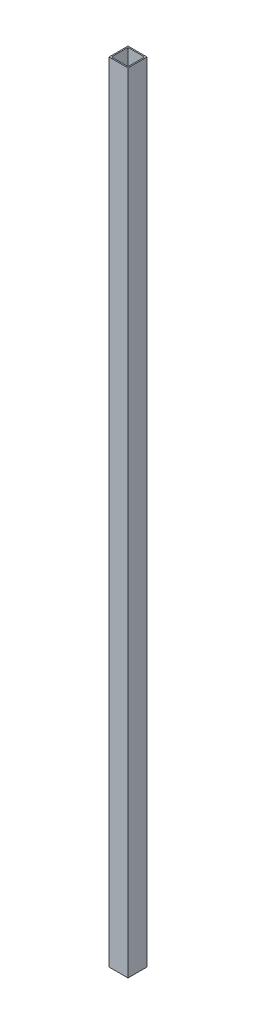
ISO-10303-21;
HEADER;
FILE_DESCRIPTION(('STEP AP214'),'2;1');
FILE_NAME('part.step','',(''),(''),'','','');
FILE_SCHEMA(('AUTOMOTIVE_DESIGN { 1 0 10303 214 1 1 1 1 }'));
ENDSEC;
DATA;
#1=APPLICATION_CONTEXT('core data for automotive mechanical design processes');
#2=APPLICATION_PROTOCOL_DEFINITION('international standard','automotive_design',2000,#1);
#3=PRODUCT_CONTEXT('',#1,'mechanical');
#4=PRODUCT('Part','Part','',(#3));
#5=PRODUCT_RELATED_PRODUCT_CATEGORY('part','',(#4));
#6=PRODUCT_DEFINITION_FORMATION('','',#4);
#7=PRODUCT_DEFINITION_CONTEXT('part definition',#1,'design');
#8=PRODUCT_DEFINITION('design','',#6,#7);
#9=PRODUCT_DEFINITION_SHAPE('','',#8);
#10=(LENGTH_UNIT() NAMED_UNIT(*) SI_UNIT(.MILLI.,.METRE.));
#11=(NAMED_UNIT(*) PLANE_ANGLE_UNIT() SI_UNIT($,.RADIAN.));
#12=(NAMED_UNIT(*) SI_UNIT($,.STERADIAN.) SOLID_ANGLE_UNIT());
#13=UNCERTAINTY_MEASURE_WITH_UNIT(LENGTH_MEASURE(1.E-05),#10,'distance_accuracy_value','');
#14=(GEOMETRIC_REPRESENTATION_CONTEXT(3) GLOBAL_UNCERTAINTY_ASSIGNED_CONTEXT((#13)) GLOBAL_UNIT_ASSIGNED_CONTEXT((#10,
#11,#12)) REPRESENTATION_CONTEXT('',''));
#15=CARTESIAN_POINT('',(0.,0.,0.));
#16=DIRECTION('',(0.,0.,1.));
#17=DIRECTION('',(1.,0.,0.));
#18=AXIS2_PLACEMENT_3D('',#15,#16,#17);
#19=CARTESIAN_POINT('',(0.,1054.1,0.));
#20=DIRECTION('',(0.,-1.,0.));
#21=DIRECTION('',(0.,0.,-1.));
#22=AXIS2_PLACEMENT_3D('',#19,#20,#21);
#23=PLANE('',#22);
#24=DIRECTION('',(0.,0.,-1.));
#25=VECTOR('',#24,1.);
#26=CARTESIAN_POINT('',(12.7,1054.1,12.7));
#27=LINE('',#26,#25);
#28=CARTESIAN_POINT('',(12.7,1054.1,12.7));
#29=VERTEX_POINT('',#28);
#30=CARTESIAN_POINT('',(12.7,1054.1,-12.7));
#31=VERTEX_POINT('',#30);
#32=EDGE_CURVE('E136',#29,#31,#27,.T.);
#33=ORIENTED_EDGE('',*,*,#32,.T.);
#34=DIRECTION('',(-1.,0.,0.));
#35=VECTOR('',#34,1.);
#36=CARTESIAN_POINT('',(-12.7,1054.1,-12.7));
#37=LINE('',#36,#35);
#38=CARTESIAN_POINT('',(-12.7,1054.1,-12.7));
#39=VERTEX_POINT('',#38);
#40=EDGE_CURVE('E139',#31,#39,#37,.T.);
#41=ORIENTED_EDGE('',*,*,#40,.T.);
#42=DIRECTION('',(0.,0.,1.));
#43=VECTOR('',#42,1.);
#44=CARTESIAN_POINT('',(-12.7,1054.1,12.7));
#45=LINE('',#44,#43);
#46=CARTESIAN_POINT('',(-12.7,1054.1,12.7));
#47=VERTEX_POINT('',#46);
#48=EDGE_CURVE('E142',#39,#47,#45,.T.);
#49=ORIENTED_EDGE('',*,*,#48,.T.);
#50=DIRECTION('',(1.,0.,0.));
#51=VECTOR('',#50,1.);
#52=CARTESIAN_POINT('',(-12.7,1054.1,12.7));
#53=LINE('',#52,#51);
#54=EDGE_CURVE('E144',#47,#29,#53,.T.);
#55=ORIENTED_EDGE('',*,*,#54,.T.);
#56=EDGE_LOOP('',(#33,#41,#49,#55));
#57=FACE_BOUND('',#56,.T.);
#58=DIRECTION('',(0.,0.,-1.));
#59=VECTOR('',#58,1.);
#60=CARTESIAN_POINT('',(11.1125,1054.1,11.1125));
#61=LINE('',#60,#59);
#62=CARTESIAN_POINT('',(11.1125,1054.1,11.1125));
#63=VERTEX_POINT('',#62);
#64=CARTESIAN_POINT('',(11.1125,1054.1,-11.1125));
#65=VERTEX_POINT('',#64);
#66=EDGE_CURVE('E100',#63,#65,#61,.T.);
#67=ORIENTED_EDGE('',*,*,#66,.F.);
#68=DIRECTION('',(1.,0.,0.));
#69=VECTOR('',#68,1.);
#70=CARTESIAN_POINT('',(-11.1125,1054.1,11.1125));
#71=LINE('',#70,#69);
#72=CARTESIAN_POINT('',(-11.1125,1054.1,11.1125));
#73=VERTEX_POINT('',#72);
#74=EDGE_CURVE('E122',#73,#63,#71,.T.);
#75=ORIENTED_EDGE('',*,*,#74,.F.);
#76=DIRECTION('',(0.,0.,1.));
#77=VECTOR('',#76,1.);
#78=CARTESIAN_POINT('',(-11.1125,1054.1,11.1125));
#79=LINE('',#78,#77);
#80=CARTESIAN_POINT('',(-11.1125,1054.1,-11.1125));
#81=VERTEX_POINT('',#80);
#82=EDGE_CURVE('E120',#81,#73,#79,.T.);
#83=ORIENTED_EDGE('',*,*,#82,.F.);
#84=DIRECTION('',(-1.,0.,0.));
#85=VECTOR('',#84,1.);
#86=CARTESIAN_POINT('',(-11.1125,1054.1,-11.1125));
#87=LINE('',#86,#85);
#88=EDGE_CURVE('E108',#65,#81,#87,.T.);
#89=ORIENTED_EDGE('',*,*,#88,.F.);
#90=EDGE_LOOP('',(#67,#75,#83,#89));
#91=FACE_BOUND('',#90,.T.);
#92=ADVANCED_FACE('F35',(#57,#91),#23,.F.);
#93=CARTESIAN_POINT('',(0.,0.,0.));
#94=DIRECTION('',(0.,-1.,0.));
#95=DIRECTION('',(0.,0.,-1.));
#96=AXIS2_PLACEMENT_3D('',#93,#94,#95);
#97=PLANE('',#96);
#98=DIRECTION('',(0.,0.,-1.));
#99=VECTOR('',#98,1.);
#100=CARTESIAN_POINT('',(12.7,0.,12.7));
#101=LINE('',#100,#99);
#102=CARTESIAN_POINT('',(12.7,0.,12.7));
#103=VERTEX_POINT('',#102);
#104=CARTESIAN_POINT('',(12.7,0.,-12.7));
#105=VERTEX_POINT('',#104);
#106=EDGE_CURVE('E116',#103,#105,#101,.T.);
#107=ORIENTED_EDGE('',*,*,#106,.F.);
#108=DIRECTION('',(1.,0.,0.));
#109=VECTOR('',#108,1.);
#110=CARTESIAN_POINT('',(-12.7,0.,12.7));
#111=LINE('',#110,#109);
#112=CARTESIAN_POINT('',(-12.7,0.,12.7));
#113=VERTEX_POINT('',#112);
#114=EDGE_CURVE('E140',#113,#103,#111,.T.);
#115=ORIENTED_EDGE('',*,*,#114,.F.);
#116=DIRECTION('',(0.,0.,1.));
#117=VECTOR('',#116,1.);
#118=CARTESIAN_POINT('',(-12.7,0.,12.7));
#119=LINE('',#118,#117);
#120=CARTESIAN_POINT('',(-12.7,0.,-12.7));
#121=VERTEX_POINT('',#120);
#122=EDGE_CURVE('E151',#121,#113,#119,.T.);
#123=ORIENTED_EDGE('',*,*,#122,.F.);
#124=DIRECTION('',(-1.,0.,0.));
#125=VECTOR('',#124,1.);
#126=CARTESIAN_POINT('',(-12.7,0.,-12.7));
#127=LINE('',#126,#125);
#128=EDGE_CURVE('E149',#105,#121,#127,.T.);
#129=ORIENTED_EDGE('',*,*,#128,.F.);
#130=EDGE_LOOP('',(#107,#115,#123,#129));
#131=FACE_BOUND('',#130,.T.);
#132=DIRECTION('',(1.,0.,0.));
#133=VECTOR('',#132,1.);
#134=CARTESIAN_POINT('',(-11.1125,0.,11.1125));
#135=LINE('',#134,#133);
#136=CARTESIAN_POINT('',(-11.1125,0.,11.1125));
#137=VERTEX_POINT('',#136);
#138=CARTESIAN_POINT('',(11.1125,0.,11.1125));
#139=VERTEX_POINT('',#138);
#140=EDGE_CURVE('E109',#137,#139,#135,.T.);
#141=ORIENTED_EDGE('',*,*,#140,.T.);
#142=DIRECTION('',(0.,0.,-1.));
#143=VECTOR('',#142,1.);
#144=CARTESIAN_POINT('',(11.1125,0.,11.1125));
#145=LINE('',#144,#143);
#146=CARTESIAN_POINT('',(11.1125,0.,-11.1125));
#147=VERTEX_POINT('',#146);
#148=EDGE_CURVE('E58',#139,#147,#145,.T.);
#149=ORIENTED_EDGE('',*,*,#148,.T.);
#150=DIRECTION('',(-1.,0.,0.));
#151=VECTOR('',#150,1.);
#152=CARTESIAN_POINT('',(-11.1125,0.,-11.1125));
#153=LINE('',#152,#151);
#154=CARTESIAN_POINT('',(-11.1125,0.,-11.1125));
#155=VERTEX_POINT('',#154);
#156=EDGE_CURVE('E115',#147,#155,#153,.T.);
#157=ORIENTED_EDGE('',*,*,#156,.T.);
#158=DIRECTION('',(0.,0.,1.));
#159=VECTOR('',#158,1.);
#160=CARTESIAN_POINT('',(-11.1125,0.,11.1125));
#161=LINE('',#160,#159);
#162=EDGE_CURVE('E128',#155,#137,#161,.T.);
#163=ORIENTED_EDGE('',*,*,#162,.T.);
#164=EDGE_LOOP('',(#141,#149,#157,#163));
#165=FACE_BOUND('',#164,.T.);
#166=ADVANCED_FACE('F169',(#131,#165),#97,.T.);
#167=CARTESIAN_POINT('',(12.7,1054.1,12.7));
#168=DIRECTION('',(-1.,0.,0.));
#169=DIRECTION('',(0.,0.,1.));
#170=AXIS2_PLACEMENT_3D('',#167,#168,#169);
#171=PLANE('',#170);
#172=ORIENTED_EDGE('',*,*,#106,.T.);
#173=DIRECTION('',(0.,-1.,0.));
#174=VECTOR('',#173,1.);
#175=CARTESIAN_POINT('',(12.7,1054.1,-12.7));
#176=LINE('',#175,#174);
#177=EDGE_CURVE('E11',#31,#105,#176,.T.);
#178=ORIENTED_EDGE('',*,*,#177,.F.);
#179=ORIENTED_EDGE('',*,*,#32,.F.);
#180=DIRECTION('',(0.,-1.,0.));
#181=VECTOR('',#180,1.);
#182=CARTESIAN_POINT('',(12.7,1054.1,12.7));
#183=LINE('',#182,#181);
#184=EDGE_CURVE('E146',#29,#103,#183,.T.);
#185=ORIENTED_EDGE('',*,*,#184,.T.);
#186=EDGE_LOOP('',(#172,#178,#179,#185));
#187=FACE_BOUND('',#186,.T.);
#188=ADVANCED_FACE('F37',(#187),#171,.F.);
#189=CARTESIAN_POINT('',(-12.7,1054.1,-12.7));
#190=DIRECTION('',(0.,0.,1.));
#191=DIRECTION('',(1.,0.,0.));
#192=AXIS2_PLACEMENT_3D('',#189,#190,#191);
#193=PLANE('',#192);
#194=ORIENTED_EDGE('',*,*,#128,.T.);
#195=DIRECTION('',(0.,-1.,0.));
#196=VECTOR('',#195,1.);
#197=CARTESIAN_POINT('',(-12.7,1054.1,-12.7));
#198=LINE('',#197,#196);
#199=EDGE_CURVE('E43',#39,#121,#198,.T.);
#200=ORIENTED_EDGE('',*,*,#199,.F.);
#201=ORIENTED_EDGE('',*,*,#40,.F.);
#202=ORIENTED_EDGE('',*,*,#177,.T.);
#203=EDGE_LOOP('',(#194,#200,#201,#202));
#204=FACE_BOUND('',#203,.T.);
#205=ADVANCED_FACE('F179',(#204),#193,.F.);
#206=CARTESIAN_POINT('',(-12.7,1054.1,12.7));
#207=DIRECTION('',(1.,0.,0.));
#208=DIRECTION('',(0.,0.,-1.));
#209=AXIS2_PLACEMENT_3D('',#206,#207,#208);
#210=PLANE('',#209);
#211=ORIENTED_EDGE('',*,*,#122,.T.);
#212=DIRECTION('',(0.,-1.,0.));
#213=VECTOR('',#212,1.);
#214=CARTESIAN_POINT('',(-12.7,1054.1,12.7));
#215=LINE('',#214,#213);
#216=EDGE_CURVE('E156',#47,#113,#215,.T.);
#217=ORIENTED_EDGE('',*,*,#216,.F.);
#218=ORIENTED_EDGE('',*,*,#48,.F.);
#219=ORIENTED_EDGE('',*,*,#199,.T.);
#220=EDGE_LOOP('',(#211,#217,#218,#219));
#221=FACE_BOUND('',#220,.T.);
#222=ADVANCED_FACE('F163',(#221),#210,.F.);
#223=CARTESIAN_POINT('',(-12.7,1054.1,12.7));
#224=DIRECTION('',(0.,0.,-1.));
#225=DIRECTION('',(-1.,0.,0.));
#226=AXIS2_PLACEMENT_3D('',#223,#224,#225);
#227=PLANE('',#226);
#228=ORIENTED_EDGE('',*,*,#114,.T.);
#229=ORIENTED_EDGE('',*,*,#184,.F.);
#230=ORIENTED_EDGE('',*,*,#54,.F.);
#231=ORIENTED_EDGE('',*,*,#216,.T.);
#232=EDGE_LOOP('',(#228,#229,#230,#231));
#233=FACE_BOUND('',#232,.T.);
#234=ADVANCED_FACE('F173',(#233),#227,.F.);
#235=CARTESIAN_POINT('',(11.1125,1054.1,11.1125));
#236=DIRECTION('',(-1.,0.,0.));
#237=DIRECTION('',(0.,0.,1.));
#238=AXIS2_PLACEMENT_3D('',#235,#236,#237);
#239=PLANE('',#238);
#240=ORIENTED_EDGE('',*,*,#148,.F.);
#241=DIRECTION('',(0.,-1.,0.));
#242=VECTOR('',#241,1.);
#243=CARTESIAN_POINT('',(11.1125,1054.1,11.1125));
#244=LINE('',#243,#242);
#245=EDGE_CURVE('E104',#63,#139,#244,.T.);
#246=ORIENTED_EDGE('',*,*,#245,.F.);
#247=ORIENTED_EDGE('',*,*,#66,.T.);
#248=DIRECTION('',(0.,-1.,0.));
#249=VECTOR('',#248,1.);
#250=CARTESIAN_POINT('',(11.1125,1054.1,-11.1125));
#251=LINE('',#250,#249);
#252=EDGE_CURVE('E103',#65,#147,#251,.T.);
#253=ORIENTED_EDGE('',*,*,#252,.T.);
#254=EDGE_LOOP('',(#240,#246,#247,#253));
#255=FACE_BOUND('',#254,.T.);
#256=ADVANCED_FACE('F102',(#255),#239,.T.);
#257=CARTESIAN_POINT('',(-11.1125,1054.1,-11.1125));
#258=DIRECTION('',(0.,0.,1.));
#259=DIRECTION('',(1.,0.,0.));
#260=AXIS2_PLACEMENT_3D('',#257,#258,#259);
#261=PLANE('',#260);
#262=ORIENTED_EDGE('',*,*,#156,.F.);
#263=ORIENTED_EDGE('',*,*,#252,.F.);
#264=ORIENTED_EDGE('',*,*,#88,.T.);
#265=DIRECTION('',(0.,-1.,0.));
#266=VECTOR('',#265,1.);
#267=CARTESIAN_POINT('',(-11.1125,1054.1,-11.1125));
#268=LINE('',#267,#266);
#269=EDGE_CURVE('E117',#81,#155,#268,.T.);
#270=ORIENTED_EDGE('',*,*,#269,.T.);
#271=EDGE_LOOP('',(#262,#263,#264,#270));
#272=FACE_BOUND('',#271,.T.);
#273=ADVANCED_FACE('F112',(#272),#261,.T.);
#274=CARTESIAN_POINT('',(-11.1125,1054.1,11.1125));
#275=DIRECTION('',(1.,0.,0.));
#276=DIRECTION('',(0.,0.,-1.));
#277=AXIS2_PLACEMENT_3D('',#274,#275,#276);
#278=PLANE('',#277);
#279=ORIENTED_EDGE('',*,*,#162,.F.);
#280=ORIENTED_EDGE('',*,*,#269,.F.);
#281=ORIENTED_EDGE('',*,*,#82,.T.);
#282=DIRECTION('',(0.,-1.,0.));
#283=VECTOR('',#282,1.);
#284=CARTESIAN_POINT('',(-11.1125,1054.1,11.1125));
#285=LINE('',#284,#283);
#286=EDGE_CURVE('E50',#73,#137,#285,.T.);
#287=ORIENTED_EDGE('',*,*,#286,.T.);
#288=EDGE_LOOP('',(#279,#280,#281,#287));
#289=FACE_BOUND('',#288,.T.);
#290=ADVANCED_FACE('F202',(#289),#278,.T.);
#291=CARTESIAN_POINT('',(-11.1125,1054.1,11.1125));
#292=DIRECTION('',(0.,0.,-1.));
#293=DIRECTION('',(-1.,0.,0.));
#294=AXIS2_PLACEMENT_3D('',#291,#292,#293);
#295=PLANE('',#294);
#296=ORIENTED_EDGE('',*,*,#140,.F.);
#297=ORIENTED_EDGE('',*,*,#286,.F.);
#298=ORIENTED_EDGE('',*,*,#74,.T.);
#299=ORIENTED_EDGE('',*,*,#245,.T.);
#300=EDGE_LOOP('',(#296,#297,#298,#299));
#301=FACE_BOUND('',#300,.T.);
#302=ADVANCED_FACE('F206',(#301),#295,.T.);
#303=CLOSED_SHELL('',(#92,#166,#188,#205,#222,#234,#256,#273,#290,#302));
#304=MANIFOLD_SOLID_BREP('B2',#303);
#305=ADVANCED_BREP_SHAPE_REPRESENTATION('',(#18,#304),#14);
#306=SHAPE_DEFINITION_REPRESENTATION(#9,#305);
ENDSEC;
END-ISO-10303-21;
